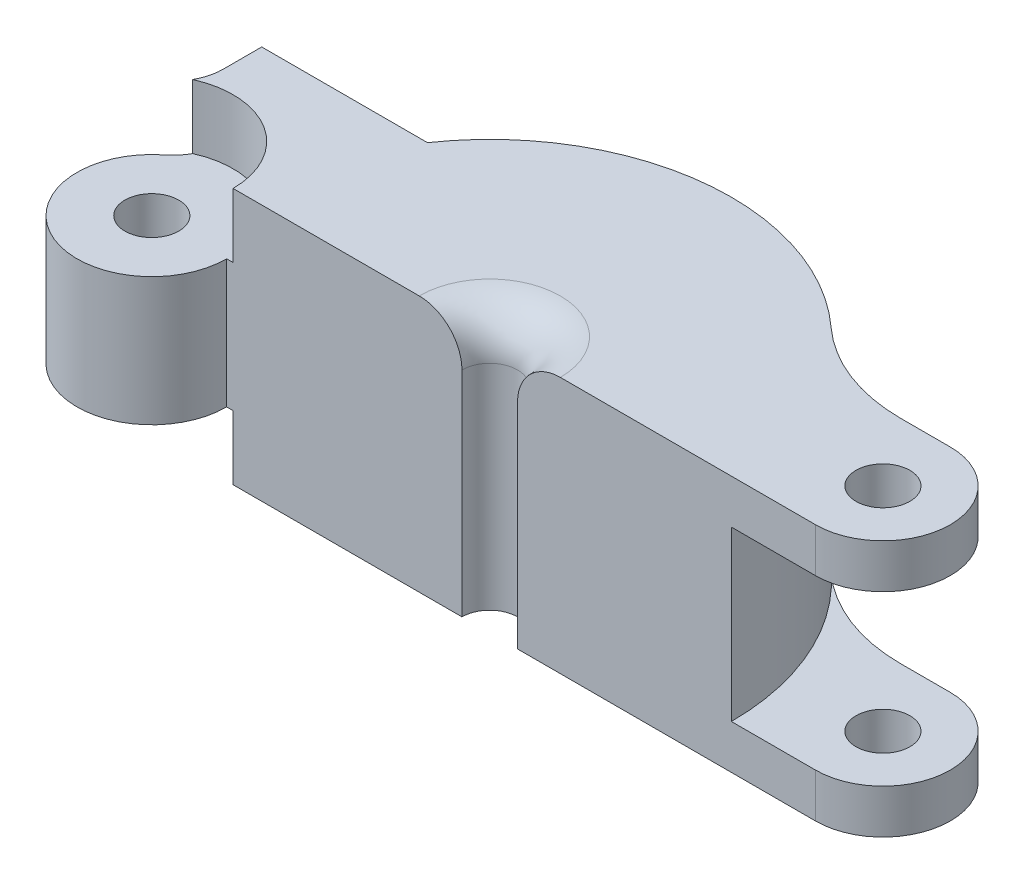
ISO-10303-21;
HEADER;
FILE_DESCRIPTION(('STEP AP214'),'2;1');
FILE_NAME('part.step','',(''),(''),'','','');
FILE_SCHEMA(('AUTOMOTIVE_DESIGN { 1 0 10303 214 1 1 1 1 }'));
ENDSEC;
DATA;
#1=APPLICATION_CONTEXT('core data for automotive mechanical design processes');
#2=APPLICATION_PROTOCOL_DEFINITION('international standard','automotive_design',2000,#1);
#3=PRODUCT_CONTEXT('',#1,'mechanical');
#4=PRODUCT('Part','Part','',(#3));
#5=PRODUCT_RELATED_PRODUCT_CATEGORY('part','',(#4));
#6=PRODUCT_DEFINITION_FORMATION('','',#4);
#7=PRODUCT_DEFINITION_CONTEXT('part definition',#1,'design');
#8=PRODUCT_DEFINITION('design','',#6,#7);
#9=PRODUCT_DEFINITION_SHAPE('','',#8);
#10=(LENGTH_UNIT() NAMED_UNIT(*) SI_UNIT(.MILLI.,.METRE.));
#11=(NAMED_UNIT(*) PLANE_ANGLE_UNIT() SI_UNIT($,.RADIAN.));
#12=(NAMED_UNIT(*) SI_UNIT($,.STERADIAN.) SOLID_ANGLE_UNIT());
#13=UNCERTAINTY_MEASURE_WITH_UNIT(LENGTH_MEASURE(1.E-05),#10,'distance_accuracy_value','');
#14=(GEOMETRIC_REPRESENTATION_CONTEXT(3) GLOBAL_UNCERTAINTY_ASSIGNED_CONTEXT((#13)) GLOBAL_UNIT_ASSIGNED_CONTEXT((#10,
#11,#12)) REPRESENTATION_CONTEXT('',''));
#15=CARTESIAN_POINT('',(0.,0.,0.));
#16=DIRECTION('',(0.,0.,1.));
#17=DIRECTION('',(1.,0.,0.));
#18=AXIS2_PLACEMENT_3D('',#15,#16,#17);
#19=CARTESIAN_POINT('',(19.351,15.24,-4.));
#20=DIRECTION('',(0.,-1.,0.));
#21=DIRECTION('',(0.,0.,-1.));
#22=AXIS2_PLACEMENT_3D('',#19,#20,#21);
#23=CYLINDRICAL_SURFACE('',#22,4.);
#24=CARTESIAN_POINT('',(19.351,2.62,-4.));
#25=DIRECTION('',(0.,1.,0.));
#26=DIRECTION('',(0.,0.,1.));
#27=AXIS2_PLACEMENT_3D('',#24,#25,#26);
#28=CIRCLE('',#27,4.);
#29=CARTESIAN_POINT('',(19.351,2.62,0.));
#30=VERTEX_POINT('',#29);
#31=CARTESIAN_POINT('',(19.351,2.62,-8.));
#32=VERTEX_POINT('',#31);
#33=EDGE_CURVE('E212',#30,#32,#28,.T.);
#34=ORIENTED_EDGE('',*,*,#33,.F.);
#35=DIRECTION('',(0.,-1.,0.));
#36=VECTOR('',#35,1.);
#37=CARTESIAN_POINT('',(19.351,15.24,0.));
#38=LINE('',#37,#36);
#39=CARTESIAN_POINT('',(19.351,0.,0.));
#40=VERTEX_POINT('',#39);
#41=EDGE_CURVE('E211',#30,#40,#38,.T.);
#42=ORIENTED_EDGE('',*,*,#41,.T.);
#43=CARTESIAN_POINT('',(19.351,0.,-4.));
#44=DIRECTION('',(0.,1.,0.));
#45=DIRECTION('',(0.,0.,1.));
#46=AXIS2_PLACEMENT_3D('',#43,#44,#45);
#47=CIRCLE('',#46,4.);
#48=CARTESIAN_POINT('',(19.351,0.,-8.));
#49=VERTEX_POINT('',#48);
#50=EDGE_CURVE('E272',#40,#49,#47,.T.);
#51=ORIENTED_EDGE('',*,*,#50,.T.);
#52=DIRECTION('',(0.,-1.,0.));
#53=VECTOR('',#52,1.);
#54=CARTESIAN_POINT('',(19.351,15.24,-8.));
#55=LINE('',#54,#53);
#56=EDGE_CURVE('E302',#32,#49,#55,.T.);
#57=ORIENTED_EDGE('',*,*,#56,.F.);
#58=EDGE_LOOP('',(#34,#42,#51,#57));
#59=FACE_BOUND('',#58,.T.);
#60=ADVANCED_FACE('F43',(#59),#23,.T.);
#61=CARTESIAN_POINT('',(0.,15.24,-8.));
#62=DIRECTION('',(0.,0.,1.));
#63=DIRECTION('',(1.,0.,0.));
#64=AXIS2_PLACEMENT_3D('',#61,#62,#63);
#65=PLANE('',#64);
#66=DIRECTION('',(-1.,0.,0.));
#67=VECTOR('',#66,1.);
#68=CARTESIAN_POINT('',(0.,0.,-8.));
#69=LINE('',#68,#67);
#70=CARTESIAN_POINT('',(16.4003414903471,0.,-8.));
#71=VERTEX_POINT('',#70);
#72=EDGE_CURVE('E275',#49,#71,#69,.T.);
#73=ORIENTED_EDGE('',*,*,#72,.T.);
#74=DIRECTION('',(0.,1.,0.));
#75=VECTOR('',#74,1.);
#76=CARTESIAN_POINT('',(16.4003414903471,2.62000000000001,-8.));
#77=LINE('',#76,#75);
#78=CARTESIAN_POINT('',(16.4003414903471,2.62,-8.));
#79=VERTEX_POINT('',#78);
#80=EDGE_CURVE('E355',#71,#79,#77,.T.);
#81=ORIENTED_EDGE('',*,*,#80,.T.);
#82=DIRECTION('',(-1.,0.,0.));
#83=VECTOR('',#82,1.);
#84=CARTESIAN_POINT('',(19.351,2.62,-8.));
#85=LINE('',#84,#83);
#86=EDGE_CURVE('E214',#32,#79,#85,.T.);
#87=ORIENTED_EDGE('',*,*,#86,.F.);
#88=ORIENTED_EDGE('',*,*,#56,.T.);
#89=EDGE_LOOP('',(#73,#81,#87,#88));
#90=FACE_BOUND('',#89,.T.);
#91=ADVANCED_FACE('F370',(#90),#65,.F.);
#92=CARTESIAN_POINT('',(19.351,15.24,-4.));
#93=DIRECTION('',(0.,-1.,0.));
#94=DIRECTION('',(0.,0.,-1.));
#95=AXIS2_PLACEMENT_3D('',#92,#93,#94);
#96=CYLINDRICAL_SURFACE('',#95,1.6);
#97=CARTESIAN_POINT('',(19.351,0.,-4.));
#98=DIRECTION('',(0.,1.,0.));
#99=DIRECTION('',(0.,0.,1.));
#100=AXIS2_PLACEMENT_3D('',#97,#98,#99);
#101=CIRCLE('',#100,1.6);
#102=CARTESIAN_POINT('',(19.351,0.,-5.6));
#103=VERTEX_POINT('',#102);
#104=EDGE_CURVE('E246',#103,#103,#101,.T.);
#105=CARTESIAN_POINT('',(19.351,2.62,-4.));
#106=DIRECTION('',(0.,1.,0.));
#107=DIRECTION('',(0.,0.,1.));
#108=AXIS2_PLACEMENT_3D('',#105,#106,#107);
#109=CIRCLE('',#108,1.6);
#110=CARTESIAN_POINT('',(19.351,2.62,-5.6));
#111=VERTEX_POINT('',#110);
#112=EDGE_CURVE('E196',#111,#111,#109,.T.);
#113=CARTESIAN_POINT('',(19.351,0.,-5.6));
#114=CARTESIAN_POINT('',(19.351,0.0272916666666668,-5.6));
#115=CARTESIAN_POINT('',(19.351,0.0545833333333336,-5.6));
#116=CARTESIAN_POINT('',(19.351,0.109166666666667,-5.6));
#117=CARTESIAN_POINT('',(19.351,0.136458333333334,-5.6));
#118=CARTESIAN_POINT('',(19.351,0.191041666666667,-5.6));
#119=CARTESIAN_POINT('',(19.351,0.218333333333333,-5.6));
#120=CARTESIAN_POINT('',(19.351,0.272916666666666,-5.6));
#121=CARTESIAN_POINT('',(19.351,0.300208333333333,-5.6));
#122=CARTESIAN_POINT('',(19.351,0.354791666666666,-5.6));
#123=CARTESIAN_POINT('',(19.351,0.382083333333333,-5.6));
#124=CARTESIAN_POINT('',(19.351,0.436666666666666,-5.6));
#125=CARTESIAN_POINT('',(19.351,0.463958333333332,-5.6));
#126=CARTESIAN_POINT('',(19.351,0.518541666666665,-5.6));
#127=CARTESIAN_POINT('',(19.351,0.545833333333332,-5.6));
#128=CARTESIAN_POINT('',(19.351,0.600416666666666,-5.6));
#129=CARTESIAN_POINT('',(19.351,0.627708333333333,-5.6));
#130=CARTESIAN_POINT('',(19.351,0.682291666666666,-5.6));
#131=CARTESIAN_POINT('',(19.351,0.709583333333333,-5.6));
#132=CARTESIAN_POINT('',(19.351,0.764166666666666,-5.6));
#133=CARTESIAN_POINT('',(19.351,0.791458333333333,-5.6));
#134=CARTESIAN_POINT('',(19.351,0.846041666666666,-5.6));
#135=CARTESIAN_POINT('',(19.351,0.873333333333332,-5.6));
#136=CARTESIAN_POINT('',(19.351,0.927916666666665,-5.6));
#137=CARTESIAN_POINT('',(19.351,0.955208333333332,-5.6));
#138=CARTESIAN_POINT('',(19.351,1.00979166666667,-5.6));
#139=CARTESIAN_POINT('',(19.351,1.03708333333333,-5.6));
#140=CARTESIAN_POINT('',(19.351,1.09166666666667,-5.6));
#141=CARTESIAN_POINT('',(19.351,1.11895833333333,-5.6));
#142=CARTESIAN_POINT('',(19.351,1.17354166666666,-5.6));
#143=CARTESIAN_POINT('',(19.351,1.20083333333333,-5.6));
#144=CARTESIAN_POINT('',(19.351,1.25541666666667,-5.6));
#145=CARTESIAN_POINT('',(19.351,1.28270833333333,-5.6));
#146=CARTESIAN_POINT('',(19.351,1.33729166666667,-5.6));
#147=CARTESIAN_POINT('',(19.351,1.36458333333333,-5.6));
#148=CARTESIAN_POINT('',(19.351,1.41916666666667,-5.6));
#149=CARTESIAN_POINT('',(19.351,1.44645833333333,-5.6));
#150=CARTESIAN_POINT('',(19.351,1.50104166666667,-5.6));
#151=CARTESIAN_POINT('',(19.351,1.52833333333333,-5.6));
#152=CARTESIAN_POINT('',(19.351,1.58291666666666,-5.6));
#153=CARTESIAN_POINT('',(19.351,1.61020833333333,-5.6));
#154=CARTESIAN_POINT('',(19.351,1.66479166666667,-5.6));
#155=CARTESIAN_POINT('',(19.351,1.69208333333333,-5.6));
#156=CARTESIAN_POINT('',(19.351,1.74666666666666,-5.6));
#157=CARTESIAN_POINT('',(19.351,1.77395833333333,-5.6));
#158=CARTESIAN_POINT('',(19.351,1.82854166666666,-5.6));
#159=CARTESIAN_POINT('',(19.351,1.85583333333333,-5.6));
#160=CARTESIAN_POINT('',(19.351,1.91041666666666,-5.6));
#161=CARTESIAN_POINT('',(19.351,1.93770833333333,-5.6));
#162=CARTESIAN_POINT('',(19.351,1.99229166666666,-5.6));
#163=CARTESIAN_POINT('',(19.351,2.01958333333333,-5.6));
#164=CARTESIAN_POINT('',(19.351,2.07416666666666,-5.6));
#165=CARTESIAN_POINT('',(19.351,2.10145833333333,-5.6));
#166=CARTESIAN_POINT('',(19.351,2.15604166666667,-5.6));
#167=CARTESIAN_POINT('',(19.351,2.18333333333333,-5.6));
#168=CARTESIAN_POINT('',(19.351,2.23791666666666,-5.6));
#169=CARTESIAN_POINT('',(19.351,2.26520833333333,-5.6));
#170=CARTESIAN_POINT('',(19.351,2.31979166666666,-5.6));
#171=CARTESIAN_POINT('',(19.351,2.34708333333333,-5.6));
#172=CARTESIAN_POINT('',(19.351,2.40166666666666,-5.6));
#173=CARTESIAN_POINT('',(19.351,2.42895833333333,-5.6));
#174=CARTESIAN_POINT('',(19.351,2.48354166666666,-5.6));
#175=CARTESIAN_POINT('',(19.351,2.51083333333333,-5.6));
#176=CARTESIAN_POINT('',(19.351,2.56541666666666,-5.6));
#177=CARTESIAN_POINT('',(19.351,2.59270833333333,-5.6));
#178=CARTESIAN_POINT('',(19.351,2.62,-5.6));
#179=B_SPLINE_CURVE_WITH_KNOTS('',3,(#113,#114,#115,#116,#117,#118,#119,#120,#121,#122,#123,
#124,#125,#126,#127,#128,#129,#130,#131,#132,#133,#134,#135,#136,#137,#138,#139,#140,#141,#142,
#143,#144,#145,#146,#147,#148,#149,#150,#151,#152,#153,#154,#155,#156,#157,#158,#159,#160,#161,
#162,#163,#164,#165,#166,#167,#168,#169,#170,#171,#172,#173,#174,#175,#176,#177,#178),
.UNSPECIFIED.,.F.,.F.,(4,2,2,2,2,2,2,2,2,2,2,2,2,2,2,2,2,2,2,2,2,2,2,2,2,2,2,2,2,2,2,2,4),(0.,
0.0818750000000004,0.163750000000001,0.245624999999999,0.3275,0.409375,0.491249999999999,
0.573124999999999,0.654999999999999,0.736875,0.81875,0.900624999999999,0.982499999999999,
1.064375,1.14625,1.228125,1.31,1.391875,1.47375,1.555625,1.6375,1.719375,1.80125,1.883125,1.965,
2.046875,2.12875,2.210625,2.2925,2.374375,2.45625,2.538125,2.62),.UNSPECIFIED.);
#180=EDGE_CURVE('BSEAM413',#103,#111,#179,.T.);
#181=ORIENTED_EDGE('',*,*,#104,.F.);
#182=ORIENTED_EDGE('',*,*,#112,.T.);
#183=ORIENTED_EDGE('',*,*,#180,.T.);
#184=ORIENTED_EDGE('',*,*,#180,.F.);
#185=EDGE_LOOP('',(#181,#183,#182,#184));
#186=FACE_BOUND('',#185,.T.);
#187=ADVANCED_FACE('F413',(#186),#96,.F.);
#188=CARTESIAN_POINT('',(-20.07,15.24,0.));
#189=DIRECTION('',(0.,-1.,0.));
#190=DIRECTION('',(0.,0.,-1.));
#191=AXIS2_PLACEMENT_3D('',#188,#189,#190);
#192=CYLINDRICAL_SURFACE('',#191,4.445);
#193=CARTESIAN_POINT('',(-20.07,11.43,0.));
#194=DIRECTION('',(0.,1.,0.));
#195=DIRECTION('',(0.,0.,1.));
#196=AXIS2_PLACEMENT_3D('',#193,#194,#195);
#197=CIRCLE('',#196,4.445);
#198=CARTESIAN_POINT('',(-22.8164069845534,11.43,-3.49503557566963));
#199=VERTEX_POINT('',#198);
#200=CARTESIAN_POINT('',(-15.625,11.43,0.));
#201=VERTEX_POINT('',#200);
#202=EDGE_CURVE('E244',#199,#201,#197,.T.);
#203=ORIENTED_EDGE('',*,*,#202,.F.);
#204=DIRECTION('',(0.,-1.,0.));
#205=VECTOR('',#204,1.);
#206=CARTESIAN_POINT('',(-22.8164069845534,15.24,-3.49503557566963));
#207=LINE('',#206,#205);
#208=CARTESIAN_POINT('',(-22.8164069845534,3.81,-3.49503557566963));
#209=VERTEX_POINT('',#208);
#210=EDGE_CURVE('E326',#199,#209,#207,.T.);
#211=ORIENTED_EDGE('',*,*,#210,.T.);
#212=CARTESIAN_POINT('',(-20.07,3.81,0.));
#213=DIRECTION('',(0.,-1.,0.));
#214=DIRECTION('',(0.,0.,-1.));
#215=AXIS2_PLACEMENT_3D('',#212,#213,#214);
#216=CIRCLE('',#215,4.445);
#217=CARTESIAN_POINT('',(-15.625,3.81,0.));
#218=VERTEX_POINT('',#217);
#219=EDGE_CURVE('E230',#218,#209,#216,.T.);
#220=ORIENTED_EDGE('',*,*,#219,.F.);
#221=DIRECTION('',(0.,-1.,0.));
#222=VECTOR('',#221,1.);
#223=CARTESIAN_POINT('',(-15.625,15.24,0.));
#224=LINE('',#223,#222);
#225=EDGE_CURVE('E293',#201,#218,#224,.T.);
#226=ORIENTED_EDGE('',*,*,#225,.F.);
#227=EDGE_LOOP('',(#203,#211,#220,#226));
#228=FACE_BOUND('',#227,.T.);
#229=ADVANCED_FACE('F454',(#228),#192,.T.);
#230=CARTESIAN_POINT('',(-20.07,15.24,0.));
#231=DIRECTION('',(0.,-1.,0.));
#232=DIRECTION('',(0.,0.,-1.));
#233=AXIS2_PLACEMENT_3D('',#230,#231,#232);
#234=CYLINDRICAL_SURFACE('',#233,1.6);
#235=CARTESIAN_POINT('',(-20.07,11.43,0.));
#236=DIRECTION('',(0.,1.,0.));
#237=DIRECTION('',(0.,0.,1.));
#238=AXIS2_PLACEMENT_3D('',#235,#236,#237);
#239=CIRCLE('',#238,1.6);
#240=CARTESIAN_POINT('',(-20.07,11.43,-1.6));
#241=VERTEX_POINT('',#240);
#242=EDGE_CURVE('E241',#241,#241,#239,.T.);
#243=CARTESIAN_POINT('',(-20.07,3.81,0.));
#244=DIRECTION('',(0.,-1.,0.));
#245=DIRECTION('',(0.,0.,-1.));
#246=AXIS2_PLACEMENT_3D('',#243,#244,#245);
#247=CIRCLE('',#246,1.6);
#248=CARTESIAN_POINT('',(-20.07,3.81,-1.6));
#249=VERTEX_POINT('',#248);
#250=EDGE_CURVE('E233',#249,#249,#247,.T.);
#251=CARTESIAN_POINT('',(-20.07,11.43,-1.6));
#252=CARTESIAN_POINT('',(-20.07,11.350625,-1.6));
#253=CARTESIAN_POINT('',(-20.07,11.27125,-1.6));
#254=CARTESIAN_POINT('',(-20.07,11.1125,-1.6));
#255=CARTESIAN_POINT('',(-20.07,11.033125,-1.6));
#256=CARTESIAN_POINT('',(-20.07,10.874375,-1.6));
#257=CARTESIAN_POINT('',(-20.07,10.795,-1.6));
#258=CARTESIAN_POINT('',(-20.07,10.63625,-1.6));
#259=CARTESIAN_POINT('',(-20.07,10.556875,-1.6));
#260=CARTESIAN_POINT('',(-20.07,10.398125,-1.6));
#261=CARTESIAN_POINT('',(-20.07,10.31875,-1.6));
#262=CARTESIAN_POINT('',(-20.07,10.16,-1.6));
#263=CARTESIAN_POINT('',(-20.07,10.080625,-1.6));
#264=CARTESIAN_POINT('',(-20.07,9.921875,-1.6));
#265=CARTESIAN_POINT('',(-20.07,9.8425,-1.6));
#266=CARTESIAN_POINT('',(-20.07,9.68375,-1.6));
#267=CARTESIAN_POINT('',(-20.07,9.604375,-1.6));
#268=CARTESIAN_POINT('',(-20.07,9.445625,-1.6));
#269=CARTESIAN_POINT('',(-20.07,9.36625,-1.6));
#270=CARTESIAN_POINT('',(-20.07,9.2075,-1.6));
#271=CARTESIAN_POINT('',(-20.07,9.128125,-1.6));
#272=CARTESIAN_POINT('',(-20.07,8.969375,-1.6));
#273=CARTESIAN_POINT('',(-20.07,8.89,-1.6));
#274=CARTESIAN_POINT('',(-20.07,8.73125,-1.6));
#275=CARTESIAN_POINT('',(-20.07,8.651875,-1.6));
#276=CARTESIAN_POINT('',(-20.07,8.493125,-1.6));
#277=CARTESIAN_POINT('',(-20.07,8.41375,-1.6));
#278=CARTESIAN_POINT('',(-20.07,8.255,-1.6));
#279=CARTESIAN_POINT('',(-20.07,8.175625,-1.6));
#280=CARTESIAN_POINT('',(-20.07,8.016875,-1.6));
#281=CARTESIAN_POINT('',(-20.07,7.9375,-1.6));
#282=CARTESIAN_POINT('',(-20.07,7.77875,-1.6));
#283=CARTESIAN_POINT('',(-20.07,7.699375,-1.6));
#284=CARTESIAN_POINT('',(-20.07,7.540625,-1.6));
#285=CARTESIAN_POINT('',(-20.07,7.46125,-1.6));
#286=CARTESIAN_POINT('',(-20.07,7.3025,-1.6));
#287=CARTESIAN_POINT('',(-20.07,7.223125,-1.6));
#288=CARTESIAN_POINT('',(-20.07,7.064375,-1.6));
#289=CARTESIAN_POINT('',(-20.07,6.985,-1.6));
#290=CARTESIAN_POINT('',(-20.07,6.82625,-1.6));
#291=CARTESIAN_POINT('',(-20.07,6.746875,-1.6));
#292=CARTESIAN_POINT('',(-20.07,6.588125,-1.6));
#293=CARTESIAN_POINT('',(-20.07,6.50875,-1.6));
#294=CARTESIAN_POINT('',(-20.07,6.35,-1.6));
#295=CARTESIAN_POINT('',(-20.07,6.270625,-1.6));
#296=CARTESIAN_POINT('',(-20.07,6.111875,-1.6));
#297=CARTESIAN_POINT('',(-20.07,6.0325,-1.6));
#298=CARTESIAN_POINT('',(-20.07,5.87375,-1.6));
#299=CARTESIAN_POINT('',(-20.07,5.794375,-1.6));
#300=CARTESIAN_POINT('',(-20.07,5.635625,-1.6));
#301=CARTESIAN_POINT('',(-20.07,5.55625,-1.6));
#302=CARTESIAN_POINT('',(-20.07,5.3975,-1.6));
#303=CARTESIAN_POINT('',(-20.07,5.318125,-1.6));
#304=CARTESIAN_POINT('',(-20.07,5.159375,-1.6));
#305=CARTESIAN_POINT('',(-20.07,5.08,-1.6));
#306=CARTESIAN_POINT('',(-20.07,4.92125,-1.6));
#307=CARTESIAN_POINT('',(-20.07,4.841875,-1.6));
#308=CARTESIAN_POINT('',(-20.07,4.683125,-1.6));
#309=CARTESIAN_POINT('',(-20.07,4.60375,-1.6));
#310=CARTESIAN_POINT('',(-20.07,4.445,-1.6));
#311=CARTESIAN_POINT('',(-20.07,4.365625,-1.6));
#312=CARTESIAN_POINT('',(-20.07,4.206875,-1.6));
#313=CARTESIAN_POINT('',(-20.07,4.1275,-1.6));
#314=CARTESIAN_POINT('',(-20.07,3.96875,-1.6));
#315=CARTESIAN_POINT('',(-20.07,3.889375,-1.6));
#316=CARTESIAN_POINT('',(-20.07,3.81,-1.6));
#317=B_SPLINE_CURVE_WITH_KNOTS('',3,(#251,#252,#253,#254,#255,#256,#257,#258,#259,#260,#261,
#262,#263,#264,#265,#266,#267,#268,#269,#270,#271,#272,#273,#274,#275,#276,#277,#278,#279,#280,
#281,#282,#283,#284,#285,#286,#287,#288,#289,#290,#291,#292,#293,#294,#295,#296,#297,#298,#299,
#300,#301,#302,#303,#304,#305,#306,#307,#308,#309,#310,#311,#312,#313,#314,#315,#316),
.UNSPECIFIED.,.F.,.F.,(4,2,2,2,2,2,2,2,2,2,2,2,2,2,2,2,2,2,2,2,2,2,2,2,2,2,2,2,2,2,2,2,4),(0.,
0.238124999999999,0.476249999999999,0.714374999999998,0.9525,1.190625,1.42875,1.666875,1.905,
2.143125,2.38125,2.619375,2.8575,3.095625,3.33375,3.571875,3.81,4.048125,4.28625,4.524375,
4.7625,5.000625,5.23875,5.476875,5.715,5.953125,6.19125,6.429375,6.6675,6.905625,7.14375,
7.381875,7.62),.UNSPECIFIED.);
#318=EDGE_CURVE('BSEAM485',#241,#249,#317,.T.);
#319=ORIENTED_EDGE('',*,*,#242,.T.);
#320=ORIENTED_EDGE('',*,*,#250,.T.);
#321=ORIENTED_EDGE('',*,*,#318,.T.);
#322=ORIENTED_EDGE('',*,*,#318,.F.);
#323=EDGE_LOOP('',(#319,#321,#320,#322));
#324=FACE_BOUND('',#323,.T.);
#325=ADVANCED_FACE('F485',(#324),#234,.F.);
#326=CARTESIAN_POINT('',(-21.67,15.24,0.));
#327=DIRECTION('',(1.,0.,0.));
#328=DIRECTION('',(0.,0.,-1.));
#329=AXIS2_PLACEMENT_3D('',#326,#327,#328);
#330=PLANE('',#329);
#331=DIRECTION('',(0.,0.,1.));
#332=VECTOR('',#331,1.);
#333=CARTESIAN_POINT('',(-21.67,0.,0.));
#334=LINE('',#333,#332);
#335=CARTESIAN_POINT('',(-21.67,0.,-8.128));
#336=VERTEX_POINT('',#335);
#337=CARTESIAN_POINT('',(-21.67,0.,-5.85388973247703));
#338=VERTEX_POINT('',#337);
#339=EDGE_CURVE('E282',#336,#338,#334,.T.);
#340=ORIENTED_EDGE('',*,*,#339,.T.);
#341=DIRECTION('',(0.,1.,0.));
#342=VECTOR('',#341,1.);
#343=CARTESIAN_POINT('',(-21.67,11.43,-5.85388973247703));
#344=LINE('',#343,#342);
#345=CARTESIAN_POINT('',(-21.67,15.24,-5.85388973247703));
#346=VERTEX_POINT('',#345);
#347=EDGE_CURVE('E329',#338,#346,#344,.T.);
#348=ORIENTED_EDGE('',*,*,#347,.T.);
#349=DIRECTION('',(0.,0.,1.));
#350=VECTOR('',#349,1.);
#351=CARTESIAN_POINT('',(-21.67,15.24,0.));
#352=LINE('',#351,#350);
#353=CARTESIAN_POINT('',(-21.67,15.24,-8.128));
#354=VERTEX_POINT('',#353);
#355=EDGE_CURVE('E261',#354,#346,#352,.T.);
#356=ORIENTED_EDGE('',*,*,#355,.F.);
#357=DIRECTION('',(0.,-1.,0.));
#358=VECTOR('',#357,1.);
#359=CARTESIAN_POINT('',(-21.67,15.24,-8.128));
#360=LINE('',#359,#358);
#361=EDGE_CURVE('E296',#354,#336,#360,.T.);
#362=ORIENTED_EDGE('',*,*,#361,.T.);
#363=EDGE_LOOP('',(#340,#348,#356,#362));
#364=FACE_BOUND('',#363,.T.);
#365=ADVANCED_FACE('F384',(#364),#330,.F.);
#366=CARTESIAN_POINT('',(0.,15.24,0.));
#367=DIRECTION('',(0.,0.,-1.));
#368=DIRECTION('',(-1.,0.,0.));
#369=AXIS2_PLACEMENT_3D('',#366,#367,#368);
#370=PLANE('',#369);
#371=DIRECTION('',(0.,-1.,0.));
#372=VECTOR('',#371,1.);
#373=CARTESIAN_POINT('',(-15.244,3.81,0.));
#374=LINE('',#373,#372);
#375=CARTESIAN_POINT('',(-15.244,0.,0.));
#376=VERTEX_POINT('',#375);
#377=CARTESIAN_POINT('',(-15.244,3.81,0.));
#378=VERTEX_POINT('',#377);
#379=EDGE_CURVE('E227',#376,#378,#374,.F.);
#380=ORIENTED_EDGE('',*,*,#379,.F.);
#381=DIRECTION('',(1.,0.,0.));
#382=VECTOR('',#381,1.);
#383=CARTESIAN_POINT('',(0.,0.,0.));
#384=LINE('',#383,#382);
#385=CARTESIAN_POINT('',(-1.651,0.,0.));
#386=VERTEX_POINT('',#385);
#387=EDGE_CURVE('E285',#376,#386,#384,.T.);
#388=ORIENTED_EDGE('',*,*,#387,.T.);
#389=DIRECTION('',(0.,-1.,0.));
#390=VECTOR('',#389,1.);
#391=CARTESIAN_POINT('',(-1.651,15.24,0.));
#392=LINE('',#391,#390);
#393=CARTESIAN_POINT('',(-1.651,12.7,0.));
#394=VERTEX_POINT('',#393);
#395=EDGE_CURVE('E290',#394,#386,#392,.T.);
#396=ORIENTED_EDGE('',*,*,#395,.F.);
#397=CARTESIAN_POINT('',(-4.191,12.7,0.));
#398=DIRECTION('',(0.,0.,-1.));
#399=DIRECTION('',(-1.,0.,0.));
#400=AXIS2_PLACEMENT_3D('',#397,#398,#399);
#401=CIRCLE('',#400,2.54);
#402=CARTESIAN_POINT('',(-4.191,15.24,0.));
#403=VERTEX_POINT('',#402);
#404=EDGE_CURVE('E316',#394,#403,#401,.F.);
#405=ORIENTED_EDGE('',*,*,#404,.T.);
#406=DIRECTION('',(1.,0.,0.));
#407=VECTOR('',#406,1.);
#408=CARTESIAN_POINT('',(0.,15.24,0.));
#409=LINE('',#408,#407);
#410=CARTESIAN_POINT('',(-15.244,15.24,0.));
#411=VERTEX_POINT('',#410);
#412=EDGE_CURVE('E264',#411,#403,#409,.T.);
#413=ORIENTED_EDGE('',*,*,#412,.F.);
#414=DIRECTION('',(0.,1.,0.));
#415=VECTOR('',#414,1.);
#416=CARTESIAN_POINT('',(-15.244,11.43,0.));
#417=LINE('',#416,#415);
#418=CARTESIAN_POINT('',(-15.244,11.43,0.));
#419=VERTEX_POINT('',#418);
#420=EDGE_CURVE('E238',#411,#419,#417,.F.);
#421=ORIENTED_EDGE('',*,*,#420,.T.);
#422=DIRECTION('',(1.,0.,0.));
#423=VECTOR('',#422,1.);
#424=CARTESIAN_POINT('',(0.,11.43,0.));
#425=LINE('',#424,#423);
#426=EDGE_CURVE('E242',#201,#419,#425,.T.);
#427=ORIENTED_EDGE('',*,*,#426,.F.);
#428=ORIENTED_EDGE('',*,*,#225,.T.);
#429=DIRECTION('',(-1.,0.,0.));
#430=VECTOR('',#429,1.);
#431=CARTESIAN_POINT('',(0.,3.81,0.));
#432=LINE('',#431,#430);
#433=EDGE_CURVE('E324',#378,#218,#432,.T.);
#434=ORIENTED_EDGE('',*,*,#433,.F.);
#435=EDGE_LOOP('',(#380,#388,#396,#405,#413,#421,#427,#428,#434));
#436=FACE_BOUND('',#435,.T.);
#437=ADVANCED_FACE('F424',(#436),#370,.F.);
#438=CARTESIAN_POINT('',(0.,15.24,0.));
#439=DIRECTION('',(0.,0.,-1.));
#440=DIRECTION('',(-1.,0.,0.));
#441=AXIS2_PLACEMENT_3D('',#438,#439,#440);
#442=PLANE('',#441);
#443=DIRECTION('',(0.,-1.,0.));
#444=VECTOR('',#443,1.);
#445=CARTESIAN_POINT('',(14.351,12.62,0.));
#446=LINE('',#445,#444);
#447=CARTESIAN_POINT('',(14.351,12.62,0.));
#448=VERTEX_POINT('',#447);
#449=CARTESIAN_POINT('',(14.351,2.62,0.));
#450=VERTEX_POINT('',#449);
#451=EDGE_CURVE('E185',#448,#450,#446,.T.);
#452=ORIENTED_EDGE('',*,*,#451,.F.);
#453=DIRECTION('',(1.,0.,0.));
#454=VECTOR('',#453,1.);
#455=CARTESIAN_POINT('',(14.351,12.62,0.));
#456=LINE('',#455,#454);
#457=CARTESIAN_POINT('',(19.351,12.62,0.));
#458=VERTEX_POINT('',#457);
#459=EDGE_CURVE('E219',#448,#458,#456,.T.);
#460=ORIENTED_EDGE('',*,*,#459,.T.);
#461=CARTESIAN_POINT('',(19.351,15.24,0.));
#462=VERTEX_POINT('',#461);
#463=EDGE_CURVE('E306',#462,#458,#38,.T.);
#464=ORIENTED_EDGE('',*,*,#463,.F.);
#465=DIRECTION('',(1.,0.,0.));
#466=VECTOR('',#465,1.);
#467=CARTESIAN_POINT('',(0.,15.24,0.));
#468=LINE('',#467,#466);
#469=CARTESIAN_POINT('',(4.191,15.24,0.));
#470=VERTEX_POINT('',#469);
#471=EDGE_CURVE('E250',#470,#462,#468,.T.);
#472=ORIENTED_EDGE('',*,*,#471,.F.);
#473=CARTESIAN_POINT('',(4.191,12.7,0.));
#474=DIRECTION('',(0.,0.,-1.));
#475=DIRECTION('',(-1.,0.,0.));
#476=AXIS2_PLACEMENT_3D('',#473,#474,#475);
#477=CIRCLE('',#476,2.54);
#478=CARTESIAN_POINT('',(1.651,12.7,0.));
#479=VERTEX_POINT('',#478);
#480=EDGE_CURVE('E320',#470,#479,#477,.F.);
#481=ORIENTED_EDGE('',*,*,#480,.T.);
#482=DIRECTION('',(0.,-1.,0.));
#483=VECTOR('',#482,1.);
#484=CARTESIAN_POINT('',(1.651,15.24,0.));
#485=LINE('',#484,#483);
#486=CARTESIAN_POINT('',(1.651,0.,0.));
#487=VERTEX_POINT('',#486);
#488=EDGE_CURVE('E267',#479,#487,#485,.T.);
#489=ORIENTED_EDGE('',*,*,#488,.T.);
#490=DIRECTION('',(1.,0.,0.));
#491=VECTOR('',#490,1.);
#492=CARTESIAN_POINT('',(0.,0.,0.));
#493=LINE('',#492,#491);
#494=EDGE_CURVE('E270',#487,#40,#493,.T.);
#495=ORIENTED_EDGE('',*,*,#494,.T.);
#496=ORIENTED_EDGE('',*,*,#41,.F.);
#497=DIRECTION('',(1.,0.,0.));
#498=VECTOR('',#497,1.);
#499=CARTESIAN_POINT('',(14.351,2.62,0.));
#500=LINE('',#499,#498);
#501=EDGE_CURVE('E201',#450,#30,#500,.T.);
#502=ORIENTED_EDGE('',*,*,#501,.F.);
#503=EDGE_LOOP('',(#452,#460,#464,#472,#481,#489,#495,#496,#502));
#504=FACE_BOUND('',#503,.T.);
#505=ADVANCED_FACE('F209',(#504),#442,.F.);
#506=ORIENTED_EDGE('',*,*,#463,.T.);
#507=CARTESIAN_POINT('',(19.351,12.62,-4.));
#508=DIRECTION('',(0.,1.,0.));
#509=DIRECTION('',(0.,0.,1.));
#510=AXIS2_PLACEMENT_3D('',#507,#508,#509);
#511=CIRCLE('',#510,4.);
#512=CARTESIAN_POINT('',(19.351,12.62,-8.));
#513=VERTEX_POINT('',#512);
#514=EDGE_CURVE('E221',#458,#513,#511,.T.);
#515=ORIENTED_EDGE('',*,*,#514,.T.);
#516=CARTESIAN_POINT('',(19.351,15.24,-8.));
#517=VERTEX_POINT('',#516);
#518=EDGE_CURVE('E303',#517,#513,#55,.T.);
#519=ORIENTED_EDGE('',*,*,#518,.F.);
#520=CARTESIAN_POINT('',(19.351,15.24,-4.));
#521=DIRECTION('',(0.,1.,0.));
#522=DIRECTION('',(0.,0.,1.));
#523=AXIS2_PLACEMENT_3D('',#520,#521,#522);
#524=CIRCLE('',#523,4.);
#525=EDGE_CURVE('E253',#462,#517,#524,.T.);
#526=ORIENTED_EDGE('',*,*,#525,.F.);
#527=EDGE_LOOP('',(#506,#515,#519,#526));
#528=FACE_BOUND('',#527,.T.);
#529=ADVANCED_FACE('F407',(#528),#23,.T.);
#530=DIRECTION('',(-1.,0.,0.));
#531=VECTOR('',#530,1.);
#532=CARTESIAN_POINT('',(19.351,12.62,-8.));
#533=LINE('',#532,#531);
#534=CARTESIAN_POINT('',(16.4003414903471,12.62,-8.));
#535=VERTEX_POINT('',#534);
#536=EDGE_CURVE('E197',#513,#535,#533,.T.);
#537=ORIENTED_EDGE('',*,*,#536,.T.);
#538=DIRECTION('',(0.,1.,0.));
#539=VECTOR('',#538,1.);
#540=CARTESIAN_POINT('',(16.4003414903471,15.24,-8.));
#541=LINE('',#540,#539);
#542=CARTESIAN_POINT('',(16.4003414903471,15.24,-8.));
#543=VERTEX_POINT('',#542);
#544=EDGE_CURVE('E58',#535,#543,#541,.T.);
#545=ORIENTED_EDGE('',*,*,#544,.T.);
#546=DIRECTION('',(-1.,0.,0.));
#547=VECTOR('',#546,1.);
#548=CARTESIAN_POINT('',(0.,15.24,-8.));
#549=LINE('',#548,#547);
#550=EDGE_CURVE('E255',#517,#543,#549,.T.);
#551=ORIENTED_EDGE('',*,*,#550,.F.);
#552=ORIENTED_EDGE('',*,*,#518,.T.);
#553=EDGE_LOOP('',(#537,#545,#551,#552));
#554=FACE_BOUND('',#553,.T.);
#555=ADVANCED_FACE('F415',(#554),#65,.F.);
#556=CARTESIAN_POINT('',(0.,15.24,0.));
#557=DIRECTION('',(0.,-1.,0.));
#558=DIRECTION('',(0.,0.,-1.));
#559=AXIS2_PLACEMENT_3D('',#556,#557,#558);
#560=CYLINDRICAL_SURFACE('',#559,14.351);
#561=CARTESIAN_POINT('',(0.,2.62,0.));
#562=DIRECTION('',(0.,-1.,0.));
#563=DIRECTION('',(0.,0.,1.));
#564=AXIS2_PLACEMENT_3D('',#561,#562,#563);
#565=CIRCLE('',#564,14.351);
#566=CARTESIAN_POINT('',(9.66536490197409,2.62,-10.6081064432672));
#567=VERTEX_POINT('',#566);
#568=EDGE_CURVE('E189',#567,#450,#565,.T.);
#569=ORIENTED_EDGE('',*,*,#568,.F.);
#570=DIRECTION('',(0.,-1.,0.));
#571=VECTOR('',#570,1.);
#572=CARTESIAN_POINT('',(9.66536490197409,15.24,-10.6081064432672));
#573=LINE('',#572,#571);
#574=CARTESIAN_POINT('',(9.66536490197409,0.,-10.6081064432672));
#575=VERTEX_POINT('',#574);
#576=EDGE_CURVE('E353',#567,#575,#573,.T.);
#577=ORIENTED_EDGE('',*,*,#576,.T.);
#578=CARTESIAN_POINT('',(0.,0.,0.));
#579=DIRECTION('',(0.,1.,0.));
#580=DIRECTION('',(0.,0.,1.));
#581=AXIS2_PLACEMENT_3D('',#578,#579,#580);
#582=CIRCLE('',#581,14.351);
#583=CARTESIAN_POINT('',(-11.8273757444329,0.,-8.128));
#584=VERTEX_POINT('',#583);
#585=EDGE_CURVE('E278',#575,#584,#582,.T.);
#586=ORIENTED_EDGE('',*,*,#585,.T.);
#587=DIRECTION('',(0.,-1.,0.));
#588=VECTOR('',#587,1.);
#589=CARTESIAN_POINT('',(-11.8273757444329,15.24,-8.128));
#590=LINE('',#589,#588);
#591=CARTESIAN_POINT('',(-11.8273757444329,15.24,-8.128));
#592=VERTEX_POINT('',#591);
#593=EDGE_CURVE('E299',#592,#584,#590,.T.);
#594=ORIENTED_EDGE('',*,*,#593,.F.);
#595=CARTESIAN_POINT('',(0.,15.24,0.));
#596=DIRECTION('',(0.,1.,0.));
#597=DIRECTION('',(0.,0.,1.));
#598=AXIS2_PLACEMENT_3D('',#595,#596,#597);
#599=CIRCLE('',#598,14.351);
#600=CARTESIAN_POINT('',(9.66536490197409,15.24,-10.6081064432672));
#601=VERTEX_POINT('',#600);
#602=EDGE_CURVE('E257',#601,#592,#599,.T.);
#603=ORIENTED_EDGE('',*,*,#602,.F.);
#604=DIRECTION('',(0.,-1.,0.));
#605=VECTOR('',#604,1.);
#606=CARTESIAN_POINT('',(9.66536490197409,15.24,-10.6081064432672));
#607=LINE('',#606,#605);
#608=CARTESIAN_POINT('',(9.66536490197409,12.62,-10.6081064432672));
#609=VERTEX_POINT('',#608);
#610=EDGE_CURVE('E347',#601,#609,#607,.T.);
#611=ORIENTED_EDGE('',*,*,#610,.T.);
#612=CARTESIAN_POINT('',(0.,12.62,0.));
#613=DIRECTION('',(0.,-1.,0.));
#614=DIRECTION('',(0.,0.,1.));
#615=AXIS2_PLACEMENT_3D('',#612,#613,#614);
#616=CIRCLE('',#615,14.351);
#617=EDGE_CURVE('E192',#609,#448,#616,.T.);
#618=ORIENTED_EDGE('',*,*,#617,.T.);
#619=ORIENTED_EDGE('',*,*,#451,.T.);
#620=EDGE_LOOP('',(#569,#577,#586,#594,#603,#611,#618,#619));
#621=FACE_BOUND('',#620,.T.);
#622=ADVANCED_FACE('F187',(#621),#560,.T.);
#623=CARTESIAN_POINT('',(0.,15.24,-8.128));
#624=DIRECTION('',(0.,0.,1.));
#625=DIRECTION('',(1.,0.,0.));
#626=AXIS2_PLACEMENT_3D('',#623,#624,#625);
#627=PLANE('',#626);
#628=DIRECTION('',(-1.,0.,0.));
#629=VECTOR('',#628,1.);
#630=CARTESIAN_POINT('',(0.,0.,-8.128));
#631=LINE('',#630,#629);
#632=EDGE_CURVE('E280',#584,#336,#631,.T.);
#633=ORIENTED_EDGE('',*,*,#632,.T.);
#634=ORIENTED_EDGE('',*,*,#361,.F.);
#635=DIRECTION('',(-1.,0.,0.));
#636=VECTOR('',#635,1.);
#637=CARTESIAN_POINT('',(0.,15.24,-8.128));
#638=LINE('',#637,#636);
#639=EDGE_CURVE('E259',#592,#354,#638,.T.);
#640=ORIENTED_EDGE('',*,*,#639,.F.);
#641=ORIENTED_EDGE('',*,*,#593,.T.);
#642=EDGE_LOOP('',(#633,#634,#640,#641));
#643=FACE_BOUND('',#642,.T.);
#644=ADVANCED_FACE('F378',(#643),#627,.F.);
#645=CARTESIAN_POINT('',(19.351,12.62,-4.));
#646=DIRECTION('',(0.,1.,0.));
#647=DIRECTION('',(0.,0.,1.));
#648=AXIS2_PLACEMENT_3D('',#645,#646,#647);
#649=CIRCLE('',#648,1.6);
#650=CARTESIAN_POINT('',(19.351,12.62,-5.6));
#651=VERTEX_POINT('',#650);
#652=EDGE_CURVE('E228',#651,#651,#649,.T.);
#653=CARTESIAN_POINT('',(19.351,15.24,-4.));
#654=DIRECTION('',(0.,1.,0.));
#655=DIRECTION('',(0.,0.,1.));
#656=AXIS2_PLACEMENT_3D('',#653,#654,#655);
#657=CIRCLE('',#656,1.6);
#658=CARTESIAN_POINT('',(19.351,15.24,-5.6));
#659=VERTEX_POINT('',#658);
#660=EDGE_CURVE('E247',#659,#659,#657,.T.);
#661=CARTESIAN_POINT('',(19.351,12.62,-5.6));
#662=CARTESIAN_POINT('',(19.351,12.6472916666667,-5.6));
#663=CARTESIAN_POINT('',(19.351,12.6745833333333,-5.6));
#664=CARTESIAN_POINT('',(19.351,12.7291666666667,-5.6));
#665=CARTESIAN_POINT('',(19.351,12.7564583333333,-5.6));
#666=CARTESIAN_POINT('',(19.351,12.8110416666667,-5.6));
#667=CARTESIAN_POINT('',(19.351,12.8383333333333,-5.6));
#668=CARTESIAN_POINT('',(19.351,12.8929166666667,-5.6));
#669=CARTESIAN_POINT('',(19.351,12.9202083333333,-5.6));
#670=CARTESIAN_POINT('',(19.351,12.9747916666667,-5.6));
#671=CARTESIAN_POINT('',(19.351,13.0020833333333,-5.6));
#672=CARTESIAN_POINT('',(19.351,13.0566666666667,-5.6));
#673=CARTESIAN_POINT('',(19.351,13.0839583333333,-5.6));
#674=CARTESIAN_POINT('',(19.351,13.1385416666667,-5.6));
#675=CARTESIAN_POINT('',(19.351,13.1658333333333,-5.6));
#676=CARTESIAN_POINT('',(19.351,13.2204166666667,-5.6));
#677=CARTESIAN_POINT('',(19.351,13.2477083333333,-5.6));
#678=CARTESIAN_POINT('',(19.351,13.3022916666667,-5.6));
#679=CARTESIAN_POINT('',(19.351,13.3295833333333,-5.6));
#680=CARTESIAN_POINT('',(19.351,13.3841666666667,-5.6));
#681=CARTESIAN_POINT('',(19.351,13.4114583333333,-5.6));
#682=CARTESIAN_POINT('',(19.351,13.4660416666667,-5.6));
#683=CARTESIAN_POINT('',(19.351,13.4933333333333,-5.6));
#684=CARTESIAN_POINT('',(19.351,13.5479166666667,-5.6));
#685=CARTESIAN_POINT('',(19.351,13.5752083333333,-5.6));
#686=CARTESIAN_POINT('',(19.351,13.6297916666667,-5.6));
#687=CARTESIAN_POINT('',(19.351,13.6570833333333,-5.6));
#688=CARTESIAN_POINT('',(19.351,13.7116666666667,-5.6));
#689=CARTESIAN_POINT('',(19.351,13.7389583333333,-5.6));
#690=CARTESIAN_POINT('',(19.351,13.7935416666667,-5.6));
#691=CARTESIAN_POINT('',(19.351,13.8208333333333,-5.6));
#692=CARTESIAN_POINT('',(19.351,13.8754166666667,-5.6));
#693=CARTESIAN_POINT('',(19.351,13.9027083333333,-5.6));
#694=CARTESIAN_POINT('',(19.351,13.9572916666667,-5.6));
#695=CARTESIAN_POINT('',(19.351,13.9845833333333,-5.6));
#696=CARTESIAN_POINT('',(19.351,14.0391666666667,-5.6));
#697=CARTESIAN_POINT('',(19.351,14.0664583333333,-5.6));
#698=CARTESIAN_POINT('',(19.351,14.1210416666667,-5.6));
#699=CARTESIAN_POINT('',(19.351,14.1483333333333,-5.6));
#700=CARTESIAN_POINT('',(19.351,14.2029166666667,-5.6));
#701=CARTESIAN_POINT('',(19.351,14.2302083333333,-5.6));
#702=CARTESIAN_POINT('',(19.351,14.2847916666667,-5.6));
#703=CARTESIAN_POINT('',(19.351,14.3120833333333,-5.6));
#704=CARTESIAN_POINT('',(19.351,14.3666666666667,-5.6));
#705=CARTESIAN_POINT('',(19.351,14.3939583333333,-5.6));
#706=CARTESIAN_POINT('',(19.351,14.4485416666667,-5.6));
#707=CARTESIAN_POINT('',(19.351,14.4758333333333,-5.6));
#708=CARTESIAN_POINT('',(19.351,14.5304166666667,-5.6));
#709=CARTESIAN_POINT('',(19.351,14.5577083333333,-5.6));
#710=CARTESIAN_POINT('',(19.351,14.6122916666667,-5.6));
#711=CARTESIAN_POINT('',(19.351,14.6395833333333,-5.6));
#712=CARTESIAN_POINT('',(19.351,14.6941666666667,-5.6));
#713=CARTESIAN_POINT('',(19.351,14.7214583333333,-5.6));
#714=CARTESIAN_POINT('',(19.351,14.7760416666667,-5.6));
#715=CARTESIAN_POINT('',(19.351,14.8033333333333,-5.6));
#716=CARTESIAN_POINT('',(19.351,14.8579166666667,-5.6));
#717=CARTESIAN_POINT('',(19.351,14.8852083333333,-5.6));
#718=CARTESIAN_POINT('',(19.351,14.9397916666667,-5.6));
#719=CARTESIAN_POINT('',(19.351,14.9670833333333,-5.6));
#720=CARTESIAN_POINT('',(19.351,15.0216666666667,-5.6));
#721=CARTESIAN_POINT('',(19.351,15.0489583333333,-5.6));
#722=CARTESIAN_POINT('',(19.351,15.1035416666667,-5.6));
#723=CARTESIAN_POINT('',(19.351,15.1308333333333,-5.6));
#724=CARTESIAN_POINT('',(19.351,15.1854166666667,-5.6));
#725=CARTESIAN_POINT('',(19.351,15.2127083333333,-5.6));
#726=CARTESIAN_POINT('',(19.351,15.24,-5.6));
#727=B_SPLINE_CURVE_WITH_KNOTS('',3,(#661,#662,#663,#664,#665,#666,#667,#668,#669,#670,#671,
#672,#673,#674,#675,#676,#677,#678,#679,#680,#681,#682,#683,#684,#685,#686,#687,#688,#689,#690,
#691,#692,#693,#694,#695,#696,#697,#698,#699,#700,#701,#702,#703,#704,#705,#706,#707,#708,#709,
#710,#711,#712,#713,#714,#715,#716,#717,#718,#719,#720,#721,#722,#723,#724,#725,#726),
.UNSPECIFIED.,.F.,.F.,(4,2,2,2,2,2,2,2,2,2,2,2,2,2,2,2,2,2,2,2,2,2,2,2,2,2,2,2,2,2,2,2,4),(0.,
0.0818750000000004,0.163750000000001,0.245625000000001,0.3275,0.409375,0.49125,
0.573125000000001,0.655000000000001,0.736875,0.81875,0.900625,0.982500000000001,1.064375,
1.14625,1.228125,1.31,1.391875,1.47375,1.555625,1.6375,1.719375,1.80125,1.883125,1.965,2.046875,
2.12875,2.210625,2.2925,2.374375,2.45625,2.538125,2.62),.UNSPECIFIED.);
#728=EDGE_CURVE('BSEAM480',#651,#659,#727,.T.);
#729=ORIENTED_EDGE('',*,*,#652,.F.);
#730=ORIENTED_EDGE('',*,*,#660,.T.);
#731=ORIENTED_EDGE('',*,*,#728,.T.);
#732=ORIENTED_EDGE('',*,*,#728,.F.);
#733=EDGE_LOOP('',(#729,#731,#730,#732));
#734=FACE_BOUND('',#733,.T.);
#735=ADVANCED_FACE('F480',(#734),#96,.F.);
#736=CARTESIAN_POINT('',(0.,15.24,0.));
#737=DIRECTION('',(0.,-1.,0.));
#738=DIRECTION('',(0.,0.,-1.));
#739=AXIS2_PLACEMENT_3D('',#736,#737,#738);
#740=CYLINDRICAL_SURFACE('',#739,1.651);
#741=ORIENTED_EDGE('',*,*,#488,.F.);
#742=CARTESIAN_POINT('',(0.,12.7,0.));
#743=DIRECTION('',(0.,1.,0.));
#744=DIRECTION('',(0.,0.,1.));
#745=AXIS2_PLACEMENT_3D('',#742,#743,#744);
#746=CIRCLE('',#745,1.651);
#747=EDGE_CURVE('E311',#479,#394,#746,.T.);
#748=ORIENTED_EDGE('',*,*,#747,.T.);
#749=ORIENTED_EDGE('',*,*,#395,.T.);
#750=CARTESIAN_POINT('',(0.,0.,0.));
#751=DIRECTION('',(0.,1.,0.));
#752=DIRECTION('',(0.,0.,1.));
#753=AXIS2_PLACEMENT_3D('',#750,#751,#752);
#754=CIRCLE('',#753,1.651);
#755=EDGE_CURVE('E251',#487,#386,#754,.T.);
#756=ORIENTED_EDGE('',*,*,#755,.F.);
#757=EDGE_LOOP('',(#741,#748,#749,#756));
#758=FACE_BOUND('',#757,.T.);
#759=ADVANCED_FACE('F439',(#758),#740,.F.);
#760=CARTESIAN_POINT('',(0.,15.24,0.));
#761=DIRECTION('',(0.,1.,0.));
#762=DIRECTION('',(0.,0.,1.));
#763=AXIS2_PLACEMENT_3D('',#760,#761,#762);
#764=PLANE('',#763);
#765=ORIENTED_EDGE('',*,*,#412,.T.);
#766=CARTESIAN_POINT('',(0.,15.24,0.));
#767=DIRECTION('',(0.,1.,0.));
#768=DIRECTION('',(0.,0.,1.));
#769=AXIS2_PLACEMENT_3D('',#766,#767,#768);
#770=CIRCLE('',#769,4.191);
#771=EDGE_CURVE('E318',#403,#470,#770,.F.);
#772=ORIENTED_EDGE('',*,*,#771,.T.);
#773=ORIENTED_EDGE('',*,*,#471,.T.);
#774=ORIENTED_EDGE('',*,*,#525,.T.);
#775=ORIENTED_EDGE('',*,*,#550,.T.);
#776=CARTESIAN_POINT('',(16.4003414903471,15.24,-18.));
#777=DIRECTION('',(0.,1.,0.));
#778=DIRECTION('',(0.,0.,1.));
#779=AXIS2_PLACEMENT_3D('',#776,#777,#778);
#780=CIRCLE('',#779,10.);
#781=EDGE_CURVE('E11',#543,#601,#780,.F.);
#782=ORIENTED_EDGE('',*,*,#781,.T.);
#783=ORIENTED_EDGE('',*,*,#602,.T.);
#784=ORIENTED_EDGE('',*,*,#639,.T.);
#785=ORIENTED_EDGE('',*,*,#355,.T.);
#786=CARTESIAN_POINT('',(-24.67,15.24,-5.85388973247703));
#787=DIRECTION('',(0.,1.,0.));
#788=DIRECTION('',(0.,0.,1.));
#789=AXIS2_PLACEMENT_3D('',#786,#787,#788);
#790=CIRCLE('',#789,3.);
#791=CARTESIAN_POINT('',(-22.0436428420781,15.24,-4.4039766043786));
#792=VERTEX_POINT('',#791);
#793=EDGE_CURVE('E339',#346,#792,#790,.F.);
#794=ORIENTED_EDGE('',*,*,#793,.T.);
#795=CARTESIAN_POINT('',(-20.07,15.24,0.));
#796=DIRECTION('',(0.,1.,0.));
#797=DIRECTION('',(0.,0.,1.));
#798=AXIS2_PLACEMENT_3D('',#795,#796,#797);
#799=CIRCLE('',#798,4.826);
#800=EDGE_CURVE('E309',#411,#792,#799,.T.);
#801=ORIENTED_EDGE('',*,*,#800,.F.);
#802=EDGE_LOOP('',(#765,#772,#773,#774,#775,#782,#783,#784,#785,#794,#801));
#803=FACE_BOUND('',#802,.T.);
#804=ORIENTED_EDGE('',*,*,#660,.F.);
#805=EDGE_LOOP('',(#804));
#806=FACE_BOUND('',#805,.T.);
#807=ADVANCED_FACE('F394',(#803,#806),#764,.T.);
#808=CARTESIAN_POINT('',(0.,0.,0.));
#809=DIRECTION('',(0.,1.,0.));
#810=DIRECTION('',(0.,0.,1.));
#811=AXIS2_PLACEMENT_3D('',#808,#809,#810);
#812=PLANE('',#811);
#813=CARTESIAN_POINT('',(-20.07,0.,0.));
#814=DIRECTION('',(0.,1.,0.));
#815=DIRECTION('',(0.,0.,1.));
#816=AXIS2_PLACEMENT_3D('',#813,#814,#815);
#817=CIRCLE('',#816,4.826);
#818=CARTESIAN_POINT('',(-22.0436428420781,0.,-4.4039766043786));
#819=VERTEX_POINT('',#818);
#820=EDGE_CURVE('E322',#819,#376,#817,.F.);
#821=ORIENTED_EDGE('',*,*,#820,.F.);
#822=CARTESIAN_POINT('',(-24.67,0.,-5.85388973247703));
#823=DIRECTION('',(0.,1.,0.));
#824=DIRECTION('',(0.,0.,1.));
#825=AXIS2_PLACEMENT_3D('',#822,#823,#824);
#826=CIRCLE('',#825,3.);
#827=EDGE_CURVE('E337',#819,#338,#826,.T.);
#828=ORIENTED_EDGE('',*,*,#827,.T.);
#829=ORIENTED_EDGE('',*,*,#339,.F.);
#830=ORIENTED_EDGE('',*,*,#632,.F.);
#831=ORIENTED_EDGE('',*,*,#585,.F.);
#832=CARTESIAN_POINT('',(16.4003414903471,0.,-18.));
#833=DIRECTION('',(0.,1.,0.));
#834=DIRECTION('',(0.,0.,1.));
#835=AXIS2_PLACEMENT_3D('',#832,#833,#834);
#836=CIRCLE('',#835,10.);
#837=EDGE_CURVE('E358',#575,#71,#836,.T.);
#838=ORIENTED_EDGE('',*,*,#837,.T.);
#839=ORIENTED_EDGE('',*,*,#72,.F.);
#840=ORIENTED_EDGE('',*,*,#50,.F.);
#841=ORIENTED_EDGE('',*,*,#494,.F.);
#842=ORIENTED_EDGE('',*,*,#755,.T.);
#843=ORIENTED_EDGE('',*,*,#387,.F.);
#844=EDGE_LOOP('',(#821,#828,#829,#830,#831,#838,#839,#840,#841,#842,#843));
#845=FACE_BOUND('',#844,.T.);
#846=ORIENTED_EDGE('',*,*,#104,.T.);
#847=EDGE_LOOP('',(#846));
#848=FACE_BOUND('',#847,.T.);
#849=ADVANCED_FACE('F363',(#845,#848),#812,.F.);
#850=CARTESIAN_POINT('',(-20.07,11.43,0.));
#851=DIRECTION('',(0.,1.,0.));
#852=DIRECTION('',(0.,0.,1.));
#853=AXIS2_PLACEMENT_3D('',#850,#851,#852);
#854=PLANE('',#853);
#855=ORIENTED_EDGE('',*,*,#242,.F.);
#856=EDGE_LOOP('',(#855));
#857=FACE_BOUND('',#856,.T.);
#858=CARTESIAN_POINT('',(-20.07,11.43,0.));
#859=DIRECTION('',(0.,1.,0.));
#860=DIRECTION('',(0.,0.,1.));
#861=AXIS2_PLACEMENT_3D('',#858,#859,#860);
#862=CIRCLE('',#861,4.826);
#863=CARTESIAN_POINT('',(-22.0436428420781,11.43,-4.4039766043786));
#864=VERTEX_POINT('',#863);
#865=EDGE_CURVE('E236',#419,#864,#862,.T.);
#866=ORIENTED_EDGE('',*,*,#865,.T.);
#867=CARTESIAN_POINT('',(-24.67,11.43,-5.85388973247703));
#868=DIRECTION('',(0.,1.,0.));
#869=DIRECTION('',(0.,0.,1.));
#870=AXIS2_PLACEMENT_3D('',#867,#868,#869);
#871=CIRCLE('',#870,3.);
#872=EDGE_CURVE('E345',#864,#199,#871,.F.);
#873=ORIENTED_EDGE('',*,*,#872,.T.);
#874=ORIENTED_EDGE('',*,*,#202,.T.);
#875=ORIENTED_EDGE('',*,*,#426,.T.);
#876=EDGE_LOOP('',(#866,#873,#874,#875));
#877=FACE_BOUND('',#876,.T.);
#878=ADVANCED_FACE('F458',(#857,#877),#854,.T.);
#879=CARTESIAN_POINT('',(-20.07,11.43,0.));
#880=DIRECTION('',(0.,1.,0.));
#881=DIRECTION('',(0.,0.,1.));
#882=AXIS2_PLACEMENT_3D('',#879,#880,#881);
#883=CYLINDRICAL_SURFACE('',#882,4.826);
#884=ORIENTED_EDGE('',*,*,#865,.F.);
#885=ORIENTED_EDGE('',*,*,#420,.F.);
#886=ORIENTED_EDGE('',*,*,#800,.T.);
#887=DIRECTION('',(0.,-1.,0.));
#888=VECTOR('',#887,1.);
#889=CARTESIAN_POINT('',(-22.0436428420781,15.24,-4.4039766043786));
#890=LINE('',#889,#888);
#891=EDGE_CURVE('E342',#792,#864,#890,.T.);
#892=ORIENTED_EDGE('',*,*,#891,.T.);
#893=EDGE_LOOP('',(#884,#885,#886,#892));
#894=FACE_BOUND('',#893,.T.);
#895=ADVANCED_FACE('F461',(#894),#883,.F.);
#896=CARTESIAN_POINT('',(0.,12.7,0.));
#897=DIRECTION('',(0.,1.,0.));
#898=DIRECTION('',(0.,0.,1.));
#899=AXIS2_PLACEMENT_3D('',#896,#897,#898);
#900=TOROIDAL_SURFACE('',#899,4.191,2.54);
#901=ORIENTED_EDGE('',*,*,#480,.F.);
#902=ORIENTED_EDGE('',*,*,#771,.F.);
#903=ORIENTED_EDGE('',*,*,#404,.F.);
#904=ORIENTED_EDGE('',*,*,#747,.F.);
#905=EDGE_LOOP('',(#901,#902,#903,#904));
#906=FACE_BOUND('',#905,.T.);
#907=ADVANCED_FACE('F433',(#906),#900,.T.);
#908=CARTESIAN_POINT('',(-20.07,3.81,0.));
#909=DIRECTION('',(0.,-1.,0.));
#910=DIRECTION('',(0.,0.,1.));
#911=AXIS2_PLACEMENT_3D('',#908,#909,#910);
#912=PLANE('',#911);
#913=ORIENTED_EDGE('',*,*,#250,.F.);
#914=EDGE_LOOP('',(#913));
#915=FACE_BOUND('',#914,.T.);
#916=ORIENTED_EDGE('',*,*,#219,.T.);
#917=CARTESIAN_POINT('',(-24.67,3.81,-5.85388973247703));
#918=DIRECTION('',(0.,-1.,0.));
#919=DIRECTION('',(0.,0.,-1.));
#920=AXIS2_PLACEMENT_3D('',#917,#918,#919);
#921=CIRCLE('',#920,3.);
#922=CARTESIAN_POINT('',(-22.0436428420781,3.81,-4.4039766043786));
#923=VERTEX_POINT('',#922);
#924=EDGE_CURVE('E331',#209,#923,#921,.F.);
#925=ORIENTED_EDGE('',*,*,#924,.T.);
#926=CARTESIAN_POINT('',(-20.07,3.81,0.));
#927=DIRECTION('',(0.,1.,0.));
#928=DIRECTION('',(0.,0.,1.));
#929=AXIS2_PLACEMENT_3D('',#926,#927,#928);
#930=CIRCLE('',#929,4.826);
#931=EDGE_CURVE('E225',#378,#923,#930,.T.);
#932=ORIENTED_EDGE('',*,*,#931,.F.);
#933=ORIENTED_EDGE('',*,*,#433,.T.);
#934=EDGE_LOOP('',(#916,#925,#932,#933));
#935=FACE_BOUND('',#934,.T.);
#936=ADVANCED_FACE('F449',(#915,#935),#912,.T.);
#937=CARTESIAN_POINT('',(-20.07,3.81,0.));
#938=DIRECTION('',(0.,-1.,0.));
#939=DIRECTION('',(0.,0.,-1.));
#940=AXIS2_PLACEMENT_3D('',#937,#938,#939);
#941=CYLINDRICAL_SURFACE('',#940,4.826);
#942=ORIENTED_EDGE('',*,*,#931,.T.);
#943=DIRECTION('',(0.,-1.,0.));
#944=VECTOR('',#943,1.);
#945=CARTESIAN_POINT('',(-22.0436428420781,3.81,-4.4039766043786));
#946=LINE('',#945,#944);
#947=EDGE_CURVE('E334',#923,#819,#946,.T.);
#948=ORIENTED_EDGE('',*,*,#947,.T.);
#949=ORIENTED_EDGE('',*,*,#820,.T.);
#950=ORIENTED_EDGE('',*,*,#379,.T.);
#951=EDGE_LOOP('',(#942,#948,#949,#950));
#952=FACE_BOUND('',#951,.T.);
#953=ADVANCED_FACE('F447',(#952),#941,.F.);
#954=CARTESIAN_POINT('',(-24.67,15.24,-5.85388973247703));
#955=DIRECTION('',(0.,-1.,0.));
#956=DIRECTION('',(0.,0.,-1.));
#957=AXIS2_PLACEMENT_3D('',#954,#955,#956);
#958=CYLINDRICAL_SURFACE('',#957,3.);
#959=ORIENTED_EDGE('',*,*,#793,.F.);
#960=ORIENTED_EDGE('',*,*,#347,.F.);
#961=ORIENTED_EDGE('',*,*,#827,.F.);
#962=ORIENTED_EDGE('',*,*,#947,.F.);
#963=ORIENTED_EDGE('',*,*,#924,.F.);
#964=ORIENTED_EDGE('',*,*,#210,.F.);
#965=ORIENTED_EDGE('',*,*,#872,.F.);
#966=ORIENTED_EDGE('',*,*,#891,.F.);
#967=EDGE_LOOP('',(#959,#960,#961,#962,#963,#964,#965,#966));
#968=FACE_BOUND('',#967,.T.);
#969=ADVANCED_FACE('F388',(#968),#958,.F.);
#970=CARTESIAN_POINT('',(0.,12.62,0.));
#971=DIRECTION('',(0.,1.,0.));
#972=DIRECTION('',(0.,0.,1.));
#973=AXIS2_PLACEMENT_3D('',#970,#971,#972);
#974=PLANE('',#973);
#975=ORIENTED_EDGE('',*,*,#652,.T.);
#976=EDGE_LOOP('',(#975));
#977=FACE_BOUND('',#976,.T.);
#978=ORIENTED_EDGE('',*,*,#617,.F.);
#979=CARTESIAN_POINT('',(16.4003414903471,12.62,-18.));
#980=DIRECTION('',(0.,1.,0.));
#981=DIRECTION('',(0.,0.,1.));
#982=AXIS2_PLACEMENT_3D('',#979,#980,#981);
#983=CIRCLE('',#982,10.);
#984=EDGE_CURVE('E51',#609,#535,#983,.T.);
#985=ORIENTED_EDGE('',*,*,#984,.T.);
#986=ORIENTED_EDGE('',*,*,#536,.F.);
#987=ORIENTED_EDGE('',*,*,#514,.F.);
#988=ORIENTED_EDGE('',*,*,#459,.F.);
#989=EDGE_LOOP('',(#978,#985,#986,#987,#988));
#990=FACE_BOUND('',#989,.T.);
#991=ADVANCED_FACE('F430',(#977,#990),#974,.F.);
#992=CARTESIAN_POINT('',(0.,2.62,0.));
#993=DIRECTION('',(0.,1.,0.));
#994=DIRECTION('',(0.,0.,1.));
#995=AXIS2_PLACEMENT_3D('',#992,#993,#994);
#996=PLANE('',#995);
#997=ORIENTED_EDGE('',*,*,#112,.F.);
#998=EDGE_LOOP('',(#997));
#999=FACE_BOUND('',#998,.T.);
#1000=ORIENTED_EDGE('',*,*,#568,.T.);
#1001=ORIENTED_EDGE('',*,*,#501,.T.);
#1002=ORIENTED_EDGE('',*,*,#33,.T.);
#1003=ORIENTED_EDGE('',*,*,#86,.T.);
#1004=CARTESIAN_POINT('',(16.4003414903471,2.62,-18.));
#1005=DIRECTION('',(0.,1.,0.));
#1006=DIRECTION('',(0.,0.,1.));
#1007=AXIS2_PLACEMENT_3D('',#1004,#1005,#1006);
#1008=CIRCLE('',#1007,10.);
#1009=EDGE_CURVE('E205',#79,#567,#1008,.F.);
#1010=ORIENTED_EDGE('',*,*,#1009,.T.);
#1011=EDGE_LOOP('',(#1000,#1001,#1002,#1003,#1010));
#1012=FACE_BOUND('',#1011,.T.);
#1013=ADVANCED_FACE('F200',(#999,#1012),#996,.T.);
#1014=CARTESIAN_POINT('',(16.4003414903471,15.24,-18.));
#1015=DIRECTION('',(0.,-1.,0.));
#1016=DIRECTION('',(0.,0.,-1.));
#1017=AXIS2_PLACEMENT_3D('',#1014,#1015,#1016);
#1018=CYLINDRICAL_SURFACE('',#1017,10.);
#1019=ORIENTED_EDGE('',*,*,#1009,.F.);
#1020=ORIENTED_EDGE('',*,*,#80,.F.);
#1021=ORIENTED_EDGE('',*,*,#837,.F.);
#1022=ORIENTED_EDGE('',*,*,#576,.F.);
#1023=EDGE_LOOP('',(#1019,#1020,#1021,#1022));
#1024=FACE_BOUND('',#1023,.T.);
#1025=ADVANCED_FACE('F373',(#1024),#1018,.F.);
#1026=CARTESIAN_POINT('',(16.4003414903471,15.24,-18.));
#1027=DIRECTION('',(0.,-1.,0.));
#1028=DIRECTION('',(0.,0.,-1.));
#1029=AXIS2_PLACEMENT_3D('',#1026,#1027,#1028);
#1030=CYLINDRICAL_SURFACE('',#1029,10.);
#1031=ORIENTED_EDGE('',*,*,#781,.F.);
#1032=ORIENTED_EDGE('',*,*,#544,.F.);
#1033=ORIENTED_EDGE('',*,*,#984,.F.);
#1034=ORIENTED_EDGE('',*,*,#610,.F.);
#1035=EDGE_LOOP('',(#1031,#1032,#1033,#1034));
#1036=FACE_BOUND('',#1035,.T.);
#1037=ADVANCED_FACE('F45',(#1036),#1030,.F.);
#1038=CLOSED_SHELL('',(#60,#91,#187,#229,#325,#365,#437,#505,#529,#555,#622,#644,#735,#759,#807,
#849,#878,#895,#907,#936,#953,#969,#991,#1013,#1025,#1037));
#1039=MANIFOLD_SOLID_BREP('B2',#1038);
#1040=ADVANCED_BREP_SHAPE_REPRESENTATION('',(#18,#1039),#14);
#1041=SHAPE_DEFINITION_REPRESENTATION(#9,#1040);
ENDSEC;
END-ISO-10303-21;
